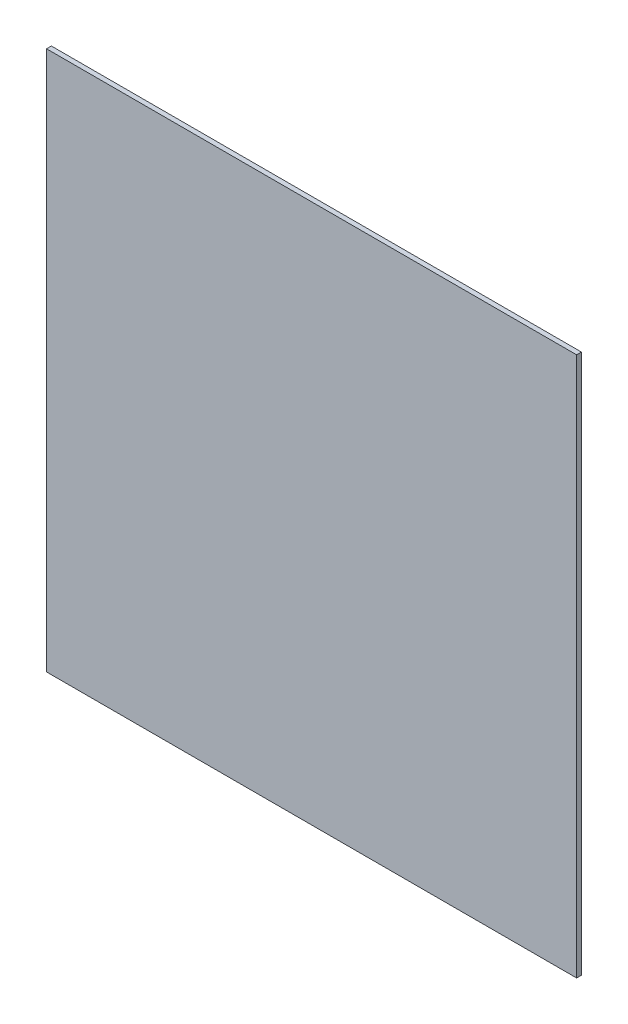
ISO-10303-21;
HEADER;
FILE_DESCRIPTION(('STEP AP214'),'2;1');
FILE_NAME('part.step','',(''),(''),'','','');
FILE_SCHEMA(('AUTOMOTIVE_DESIGN { 1 0 10303 214 1 1 1 1 }'));
ENDSEC;
DATA;
#1=APPLICATION_CONTEXT('core data for automotive mechanical design processes');
#2=APPLICATION_PROTOCOL_DEFINITION('international standard','automotive_design',2000,#1);
#3=PRODUCT_CONTEXT('',#1,'mechanical');
#4=PRODUCT('Part','Part','',(#3));
#5=PRODUCT_RELATED_PRODUCT_CATEGORY('part','',(#4));
#6=PRODUCT_DEFINITION_FORMATION('','',#4);
#7=PRODUCT_DEFINITION_CONTEXT('part definition',#1,'design');
#8=PRODUCT_DEFINITION('design','',#6,#7);
#9=PRODUCT_DEFINITION_SHAPE('','',#8);
#10=(LENGTH_UNIT() NAMED_UNIT(*) SI_UNIT(.MILLI.,.METRE.));
#11=(NAMED_UNIT(*) PLANE_ANGLE_UNIT() SI_UNIT($,.RADIAN.));
#12=(NAMED_UNIT(*) SI_UNIT($,.STERADIAN.) SOLID_ANGLE_UNIT());
#13=UNCERTAINTY_MEASURE_WITH_UNIT(LENGTH_MEASURE(1.E-05),#10,'distance_accuracy_value','');
#14=(GEOMETRIC_REPRESENTATION_CONTEXT(3) GLOBAL_UNCERTAINTY_ASSIGNED_CONTEXT((#13)) GLOBAL_UNIT_ASSIGNED_CONTEXT((#10,
#11,#12)) REPRESENTATION_CONTEXT('',''));
#15=CARTESIAN_POINT('',(0.,0.,0.));
#16=DIRECTION('',(0.,0.,1.));
#17=DIRECTION('',(1.,0.,0.));
#18=AXIS2_PLACEMENT_3D('',#15,#16,#17);
#19=CARTESIAN_POINT('',(0.,0.,0.));
#20=DIRECTION('',(0.,0.,1.));
#21=DIRECTION('',(1.,0.,0.));
#22=AXIS2_PLACEMENT_3D('',#19,#20,#21);
#23=PLANE('',#22);
#24=DIRECTION('',(0.,-1.,0.));
#25=VECTOR('',#24,1.);
#26=CARTESIAN_POINT('',(-2750.,-2800.,0.));
#27=LINE('',#26,#25);
#28=CARTESIAN_POINT('',(-2750.,2800.,0.));
#29=VERTEX_POINT('',#28);
#30=CARTESIAN_POINT('',(-2750.,-2800.,0.));
#31=VERTEX_POINT('',#30);
#32=EDGE_CURVE('E158',#29,#31,#27,.T.);
#33=ORIENTED_EDGE('',*,*,#32,.F.);
#34=DIRECTION('',(-1.,0.,0.));
#35=VECTOR('',#34,1.);
#36=CARTESIAN_POINT('',(2750.,2800.,0.));
#37=LINE('',#36,#35);
#38=CARTESIAN_POINT('',(2750.,2800.,0.));
#39=VERTEX_POINT('',#38);
#40=EDGE_CURVE('E193',#39,#29,#37,.T.);
#41=ORIENTED_EDGE('',*,*,#40,.F.);
#42=DIRECTION('',(0.,1.,0.));
#43=VECTOR('',#42,1.);
#44=CARTESIAN_POINT('',(2750.,-2800.,0.));
#45=LINE('',#44,#43);
#46=CARTESIAN_POINT('',(2750.,-2800.,0.));
#47=VERTEX_POINT('',#46);
#48=EDGE_CURVE('E204',#47,#39,#45,.T.);
#49=ORIENTED_EDGE('',*,*,#48,.F.);
#50=DIRECTION('',(1.,0.,0.));
#51=VECTOR('',#50,1.);
#52=CARTESIAN_POINT('',(2750.,-2800.,0.));
#53=LINE('',#52,#51);
#54=EDGE_CURVE('E202',#31,#47,#53,.T.);
#55=ORIENTED_EDGE('',*,*,#54,.F.);
#56=EDGE_LOOP('',(#33,#41,#49,#55));
#57=FACE_BOUND('',#56,.T.);
#58=DIRECTION('',(1.,0.,0.));
#59=VECTOR('',#58,1.);
#60=CARTESIAN_POINT('',(-2.96059473233375E-13,-1000.,0.));
#61=LINE('',#60,#59);
#62=CARTESIAN_POINT('',(624.999999999999,-1000.,0.));
#63=VERTEX_POINT('',#62);
#64=CARTESIAN_POINT('',(1375.,-1000.,0.));
#65=VERTEX_POINT('',#64);
#66=EDGE_CURVE('E175',#63,#65,#61,.T.);
#67=ORIENTED_EDGE('',*,*,#66,.F.);
#68=DIRECTION('',(0.,1.,0.));
#69=VECTOR('',#68,1.);
#70=CARTESIAN_POINT('',(624.999999999999,0.,0.));
#71=LINE('',#70,#69);
#72=CARTESIAN_POINT('',(624.999999999999,-1750.,0.));
#73=VERTEX_POINT('',#72);
#74=EDGE_CURVE('E56',#73,#63,#71,.T.);
#75=ORIENTED_EDGE('',*,*,#74,.F.);
#76=DIRECTION('',(1.,0.,0.));
#77=VECTOR('',#76,1.);
#78=CARTESIAN_POINT('',(-5.18104078158406E-13,-1750.,0.));
#79=LINE('',#78,#77);
#80=CARTESIAN_POINT('',(1375.,-1750.,0.));
#81=VERTEX_POINT('',#80);
#82=EDGE_CURVE('E166',#73,#81,#79,.T.);
#83=ORIENTED_EDGE('',*,*,#82,.T.);
#84=DIRECTION('',(0.,1.,0.));
#85=VECTOR('',#84,1.);
#86=CARTESIAN_POINT('',(1375.,0.,0.));
#87=LINE('',#86,#85);
#88=EDGE_CURVE('E178',#81,#65,#87,.T.);
#89=ORIENTED_EDGE('',*,*,#88,.T.);
#90=EDGE_LOOP('',(#67,#75,#83,#89));
#91=FACE_BOUND('',#90,.T.);
#92=DIRECTION('',(1.,0.,0.));
#93=VECTOR('',#92,1.);
#94=CARTESIAN_POINT('',(4.44089209850062E-13,999.999999999999,0.));
#95=LINE('',#94,#93);
#96=CARTESIAN_POINT('',(624.999999999999,999.999999999999,0.));
#97=VERTEX_POINT('',#96);
#98=CARTESIAN_POINT('',(1375.,999.999999999999,0.));
#99=VERTEX_POINT('',#98);
#100=EDGE_CURVE('E48',#97,#99,#95,.T.);
#101=ORIENTED_EDGE('',*,*,#100,.T.);
#102=DIRECTION('',(0.,1.,0.));
#103=VECTOR('',#102,1.);
#104=CARTESIAN_POINT('',(1375.,0.,0.));
#105=LINE('',#104,#103);
#106=CARTESIAN_POINT('',(1375.,1750.,0.));
#107=VERTEX_POINT('',#106);
#108=EDGE_CURVE('E138',#99,#107,#105,.T.);
#109=ORIENTED_EDGE('',*,*,#108,.T.);
#110=DIRECTION('',(1.,0.,0.));
#111=VECTOR('',#110,1.);
#112=CARTESIAN_POINT('',(0.,1750.,0.));
#113=LINE('',#112,#111);
#114=CARTESIAN_POINT('',(624.999999999999,1750.,0.));
#115=VERTEX_POINT('',#114);
#116=EDGE_CURVE('E151',#115,#107,#113,.T.);
#117=ORIENTED_EDGE('',*,*,#116,.F.);
#118=DIRECTION('',(0.,1.,0.));
#119=VECTOR('',#118,1.);
#120=CARTESIAN_POINT('',(624.999999999999,0.,0.));
#121=LINE('',#120,#119);
#122=EDGE_CURVE('E148',#97,#115,#121,.T.);
#123=ORIENTED_EDGE('',*,*,#122,.F.);
#124=EDGE_LOOP('',(#101,#109,#117,#123));
#125=FACE_BOUND('',#124,.T.);
#126=ADVANCED_FACE('F33',(#57,#91,#125),#23,.F.);
#127=CARTESIAN_POINT('',(-2750.,-2800.,50.));
#128=DIRECTION('',(1.,0.,0.));
#129=DIRECTION('',(0.,0.,-1.));
#130=AXIS2_PLACEMENT_3D('',#127,#128,#129);
#131=PLANE('',#130);
#132=ORIENTED_EDGE('',*,*,#32,.T.);
#133=DIRECTION('',(0.,0.,-1.));
#134=VECTOR('',#133,1.);
#135=CARTESIAN_POINT('',(-2750.,-2800.,50.));
#136=LINE('',#135,#134);
#137=CARTESIAN_POINT('',(-2750.,-2800.,50.));
#138=VERTEX_POINT('',#137);
#139=EDGE_CURVE('E11',#138,#31,#136,.T.);
#140=ORIENTED_EDGE('',*,*,#139,.F.);
#141=DIRECTION('',(0.,-1.,0.));
#142=VECTOR('',#141,1.);
#143=CARTESIAN_POINT('',(-2750.,-2800.,50.));
#144=LINE('',#143,#142);
#145=CARTESIAN_POINT('',(-2750.,2800.,50.));
#146=VERTEX_POINT('',#145);
#147=EDGE_CURVE('E189',#146,#138,#144,.T.);
#148=ORIENTED_EDGE('',*,*,#147,.F.);
#149=DIRECTION('',(0.,0.,-1.));
#150=VECTOR('',#149,1.);
#151=CARTESIAN_POINT('',(-2750.,2800.,50.));
#152=LINE('',#151,#150);
#153=EDGE_CURVE('E199',#146,#29,#152,.T.);
#154=ORIENTED_EDGE('',*,*,#153,.T.);
#155=EDGE_LOOP('',(#132,#140,#148,#154));
#156=FACE_BOUND('',#155,.T.);
#157=ADVANCED_FACE('F35',(#156),#131,.F.);
#158=CARTESIAN_POINT('',(2750.,-2800.,50.));
#159=DIRECTION('',(0.,1.,0.));
#160=DIRECTION('',(-1.,0.,0.));
#161=AXIS2_PLACEMENT_3D('',#158,#159,#160);
#162=PLANE('',#161);
#163=ORIENTED_EDGE('',*,*,#54,.T.);
#164=DIRECTION('',(0.,0.,-1.));
#165=VECTOR('',#164,1.);
#166=CARTESIAN_POINT('',(2750.,-2800.,50.));
#167=LINE('',#166,#165);
#168=CARTESIAN_POINT('',(2750.,-2800.,50.));
#169=VERTEX_POINT('',#168);
#170=EDGE_CURVE('E41',#169,#47,#167,.T.);
#171=ORIENTED_EDGE('',*,*,#170,.F.);
#172=DIRECTION('',(1.,0.,0.));
#173=VECTOR('',#172,1.);
#174=CARTESIAN_POINT('',(2750.,-2800.,50.));
#175=LINE('',#174,#173);
#176=EDGE_CURVE('E192',#138,#169,#175,.T.);
#177=ORIENTED_EDGE('',*,*,#176,.F.);
#178=ORIENTED_EDGE('',*,*,#139,.T.);
#179=EDGE_LOOP('',(#163,#171,#177,#178));
#180=FACE_BOUND('',#179,.T.);
#181=ADVANCED_FACE('F232',(#180),#162,.F.);
#182=CARTESIAN_POINT('',(2750.,-2800.,50.));
#183=DIRECTION('',(-1.,0.,0.));
#184=DIRECTION('',(0.,-1.,0.));
#185=AXIS2_PLACEMENT_3D('',#182,#183,#184);
#186=PLANE('',#185);
#187=ORIENTED_EDGE('',*,*,#48,.T.);
#188=DIRECTION('',(0.,0.,-1.));
#189=VECTOR('',#188,1.);
#190=CARTESIAN_POINT('',(2750.,2800.,50.));
#191=LINE('',#190,#189);
#192=CARTESIAN_POINT('',(2750.,2800.,50.));
#193=VERTEX_POINT('',#192);
#194=EDGE_CURVE('E209',#193,#39,#191,.T.);
#195=ORIENTED_EDGE('',*,*,#194,.F.);
#196=DIRECTION('',(0.,1.,0.));
#197=VECTOR('',#196,1.);
#198=CARTESIAN_POINT('',(2750.,-2800.,50.));
#199=LINE('',#198,#197);
#200=EDGE_CURVE('E195',#169,#193,#199,.T.);
#201=ORIENTED_EDGE('',*,*,#200,.F.);
#202=ORIENTED_EDGE('',*,*,#170,.T.);
#203=EDGE_LOOP('',(#187,#195,#201,#202));
#204=FACE_BOUND('',#203,.T.);
#205=ADVANCED_FACE('F216',(#204),#186,.F.);
#206=CARTESIAN_POINT('',(2750.,2800.,50.));
#207=DIRECTION('',(0.,-1.,0.));
#208=DIRECTION('',(1.,0.,0.));
#209=AXIS2_PLACEMENT_3D('',#206,#207,#208);
#210=PLANE('',#209);
#211=ORIENTED_EDGE('',*,*,#40,.T.);
#212=ORIENTED_EDGE('',*,*,#153,.F.);
#213=DIRECTION('',(-1.,0.,0.));
#214=VECTOR('',#213,1.);
#215=CARTESIAN_POINT('',(2750.,2800.,50.));
#216=LINE('',#215,#214);
#217=EDGE_CURVE('E197',#193,#146,#216,.T.);
#218=ORIENTED_EDGE('',*,*,#217,.F.);
#219=ORIENTED_EDGE('',*,*,#194,.T.);
#220=EDGE_LOOP('',(#211,#212,#218,#219));
#221=FACE_BOUND('',#220,.T.);
#222=ADVANCED_FACE('F225',(#221),#210,.F.);
#223=CARTESIAN_POINT('',(0.,0.,50.));
#224=DIRECTION('',(0.,0.,1.));
#225=DIRECTION('',(1.,0.,0.));
#226=AXIS2_PLACEMENT_3D('',#223,#224,#225);
#227=PLANE('',#226);
#228=ORIENTED_EDGE('',*,*,#147,.T.);
#229=ORIENTED_EDGE('',*,*,#176,.T.);
#230=ORIENTED_EDGE('',*,*,#200,.T.);
#231=ORIENTED_EDGE('',*,*,#217,.T.);
#232=EDGE_LOOP('',(#228,#229,#230,#231));
#233=FACE_BOUND('',#232,.T.);
#234=ADVANCED_FACE('F231',(#233),#227,.T.);
#235=CARTESIAN_POINT('',(624.999999999999,0.,10.));
#236=DIRECTION('',(-1.,0.,0.));
#237=DIRECTION('',(0.,0.,1.));
#238=AXIS2_PLACEMENT_3D('',#235,#236,#237);
#239=PLANE('',#238);
#240=ORIENTED_EDGE('',*,*,#74,.T.);
#241=DIRECTION('',(0.,0.,-1.));
#242=VECTOR('',#241,1.);
#243=CARTESIAN_POINT('',(624.999999999999,-1000.,10.));
#244=LINE('',#243,#242);
#245=CARTESIAN_POINT('',(624.999999999999,-1000.,10.));
#246=VERTEX_POINT('',#245);
#247=EDGE_CURVE('E173',#246,#63,#244,.T.);
#248=ORIENTED_EDGE('',*,*,#247,.F.);
#249=DIRECTION('',(0.,1.,0.));
#250=VECTOR('',#249,1.);
#251=CARTESIAN_POINT('',(624.999999999999,0.,10.));
#252=LINE('',#251,#250);
#253=CARTESIAN_POINT('',(624.999999999999,-1750.,10.));
#254=VERTEX_POINT('',#253);
#255=EDGE_CURVE('E162',#254,#246,#252,.T.);
#256=ORIENTED_EDGE('',*,*,#255,.F.);
#257=DIRECTION('',(0.,0.,-1.));
#258=VECTOR('',#257,1.);
#259=CARTESIAN_POINT('',(624.999999999999,-1750.,10.));
#260=LINE('',#259,#258);
#261=EDGE_CURVE('E149',#254,#73,#260,.T.);
#262=ORIENTED_EDGE('',*,*,#261,.T.);
#263=EDGE_LOOP('',(#240,#248,#256,#262));
#264=FACE_BOUND('',#263,.T.);
#265=ADVANCED_FACE('F252',(#264),#239,.F.);
#266=CARTESIAN_POINT('',(-5.18104078158406E-13,-1750.,10.));
#267=DIRECTION('',(0.,1.,0.));
#268=DIRECTION('',(-1.,0.,0.));
#269=AXIS2_PLACEMENT_3D('',#266,#267,#268);
#270=PLANE('',#269);
#271=ORIENTED_EDGE('',*,*,#82,.F.);
#272=ORIENTED_EDGE('',*,*,#261,.F.);
#273=DIRECTION('',(1.,0.,0.));
#274=VECTOR('',#273,1.);
#275=CARTESIAN_POINT('',(-5.18104078158406E-13,-1750.,10.));
#276=LINE('',#275,#274);
#277=CARTESIAN_POINT('',(1375.,-1750.,10.));
#278=VERTEX_POINT('',#277);
#279=EDGE_CURVE('E171',#254,#278,#276,.T.);
#280=ORIENTED_EDGE('',*,*,#279,.T.);
#281=DIRECTION('',(0.,0.,-1.));
#282=VECTOR('',#281,1.);
#283=CARTESIAN_POINT('',(1375.,-1750.,10.));
#284=LINE('',#283,#282);
#285=EDGE_CURVE('E184',#278,#81,#284,.T.);
#286=ORIENTED_EDGE('',*,*,#285,.T.);
#287=EDGE_LOOP('',(#271,#272,#280,#286));
#288=FACE_BOUND('',#287,.T.);
#289=ADVANCED_FACE('F256',(#288),#270,.T.);
#290=CARTESIAN_POINT('',(1375.,0.,10.));
#291=DIRECTION('',(-1.,0.,0.));
#292=DIRECTION('',(0.,0.,1.));
#293=AXIS2_PLACEMENT_3D('',#290,#291,#292);
#294=PLANE('',#293);
#295=ORIENTED_EDGE('',*,*,#88,.F.);
#296=ORIENTED_EDGE('',*,*,#285,.F.);
#297=DIRECTION('',(0.,1.,0.));
#298=VECTOR('',#297,1.);
#299=CARTESIAN_POINT('',(1375.,0.,10.));
#300=LINE('',#299,#298);
#301=CARTESIAN_POINT('',(1375.,-1000.,10.));
#302=VERTEX_POINT('',#301);
#303=EDGE_CURVE('E169',#278,#302,#300,.T.);
#304=ORIENTED_EDGE('',*,*,#303,.T.);
#305=DIRECTION('',(0.,0.,-1.));
#306=VECTOR('',#305,1.);
#307=CARTESIAN_POINT('',(1375.,-1000.,10.));
#308=LINE('',#307,#306);
#309=EDGE_CURVE('E186',#302,#65,#308,.T.);
#310=ORIENTED_EDGE('',*,*,#309,.T.);
#311=EDGE_LOOP('',(#295,#296,#304,#310));
#312=FACE_BOUND('',#311,.T.);
#313=ADVANCED_FACE('F259',(#312),#294,.T.);
#314=CARTESIAN_POINT('',(-2.96059473233375E-13,-1000.,10.));
#315=DIRECTION('',(0.,1.,0.));
#316=DIRECTION('',(-1.,0.,0.));
#317=AXIS2_PLACEMENT_3D('',#314,#315,#316);
#318=PLANE('',#317);
#319=ORIENTED_EDGE('',*,*,#66,.T.);
#320=ORIENTED_EDGE('',*,*,#309,.F.);
#321=DIRECTION('',(1.,0.,0.));
#322=VECTOR('',#321,1.);
#323=CARTESIAN_POINT('',(-2.96059473233375E-13,-1000.,10.));
#324=LINE('',#323,#322);
#325=EDGE_CURVE('E165',#246,#302,#324,.T.);
#326=ORIENTED_EDGE('',*,*,#325,.F.);
#327=ORIENTED_EDGE('',*,*,#247,.T.);
#328=EDGE_LOOP('',(#319,#320,#326,#327));
#329=FACE_BOUND('',#328,.T.);
#330=ADVANCED_FACE('F263',(#329),#318,.F.);
#331=CARTESIAN_POINT('',(0.,0.,10.));
#332=DIRECTION('',(0.,0.,-1.));
#333=DIRECTION('',(-1.,0.,0.));
#334=AXIS2_PLACEMENT_3D('',#331,#332,#333);
#335=PLANE('',#334);
#336=ORIENTED_EDGE('',*,*,#255,.T.);
#337=ORIENTED_EDGE('',*,*,#325,.T.);
#338=ORIENTED_EDGE('',*,*,#303,.F.);
#339=ORIENTED_EDGE('',*,*,#279,.F.);
#340=EDGE_LOOP('',(#336,#337,#338,#339));
#341=FACE_BOUND('',#340,.T.);
#342=ADVANCED_FACE('F266',(#341),#335,.T.);
#343=CARTESIAN_POINT('',(4.44089209850062E-13,999.999999999999,10.));
#344=DIRECTION('',(0.,1.,0.));
#345=DIRECTION('',(-1.,0.,0.));
#346=AXIS2_PLACEMENT_3D('',#343,#344,#345);
#347=PLANE('',#346);
#348=ORIENTED_EDGE('',*,*,#100,.F.);
#349=DIRECTION('',(0.,0.,-1.));
#350=VECTOR('',#349,1.);
#351=CARTESIAN_POINT('',(624.999999999999,999.999999999999,10.));
#352=LINE('',#351,#350);
#353=CARTESIAN_POINT('',(624.999999999999,999.999999999999,10.));
#354=VERTEX_POINT('',#353);
#355=EDGE_CURVE('E121',#354,#97,#352,.T.);
#356=ORIENTED_EDGE('',*,*,#355,.F.);
#357=DIRECTION('',(1.,0.,0.));
#358=VECTOR('',#357,1.);
#359=CARTESIAN_POINT('',(4.44089209850062E-13,999.999999999999,10.));
#360=LINE('',#359,#358);
#361=CARTESIAN_POINT('',(1375.,999.999999999999,10.));
#362=VERTEX_POINT('',#361);
#363=EDGE_CURVE('E124',#354,#362,#360,.T.);
#364=ORIENTED_EDGE('',*,*,#363,.T.);
#365=DIRECTION('',(0.,0.,-1.));
#366=VECTOR('',#365,1.);
#367=CARTESIAN_POINT('',(1375.,999.999999999999,10.));
#368=LINE('',#367,#366);
#369=EDGE_CURVE('E156',#362,#99,#368,.T.);
#370=ORIENTED_EDGE('',*,*,#369,.T.);
#371=EDGE_LOOP('',(#348,#356,#364,#370));
#372=FACE_BOUND('',#371,.T.);
#373=ADVANCED_FACE('F123',(#372),#347,.T.);
#374=CARTESIAN_POINT('',(1375.,0.,10.));
#375=DIRECTION('',(-1.,0.,0.));
#376=DIRECTION('',(0.,0.,1.));
#377=AXIS2_PLACEMENT_3D('',#374,#375,#376);
#378=PLANE('',#377);
#379=ORIENTED_EDGE('',*,*,#108,.F.);
#380=ORIENTED_EDGE('',*,*,#369,.F.);
#381=DIRECTION('',(0.,1.,0.));
#382=VECTOR('',#381,1.);
#383=CARTESIAN_POINT('',(1375.,0.,10.));
#384=LINE('',#383,#382);
#385=CARTESIAN_POINT('',(1375.,1750.,10.));
#386=VERTEX_POINT('',#385);
#387=EDGE_CURVE('E131',#362,#386,#384,.T.);
#388=ORIENTED_EDGE('',*,*,#387,.T.);
#389=DIRECTION('',(0.,0.,-1.));
#390=VECTOR('',#389,1.);
#391=CARTESIAN_POINT('',(1375.,1750.,10.));
#392=LINE('',#391,#390);
#393=EDGE_CURVE('E159',#386,#107,#392,.T.);
#394=ORIENTED_EDGE('',*,*,#393,.T.);
#395=EDGE_LOOP('',(#379,#380,#388,#394));
#396=FACE_BOUND('',#395,.T.);
#397=ADVANCED_FACE('F276',(#396),#378,.T.);
#398=CARTESIAN_POINT('',(0.,1750.,10.));
#399=DIRECTION('',(0.,1.,0.));
#400=DIRECTION('',(0.,0.,1.));
#401=AXIS2_PLACEMENT_3D('',#398,#399,#400);
#402=PLANE('',#401);
#403=ORIENTED_EDGE('',*,*,#116,.T.);
#404=ORIENTED_EDGE('',*,*,#393,.F.);
#405=DIRECTION('',(1.,0.,0.));
#406=VECTOR('',#405,1.);
#407=CARTESIAN_POINT('',(0.,1750.,10.));
#408=LINE('',#407,#406);
#409=CARTESIAN_POINT('',(624.999999999999,1750.,10.));
#410=VERTEX_POINT('',#409);
#411=EDGE_CURVE('E142',#410,#386,#408,.T.);
#412=ORIENTED_EDGE('',*,*,#411,.F.);
#413=DIRECTION('',(0.,0.,-1.));
#414=VECTOR('',#413,1.);
#415=CARTESIAN_POINT('',(624.999999999999,1750.,10.));
#416=LINE('',#415,#414);
#417=EDGE_CURVE('E130',#410,#115,#416,.T.);
#418=ORIENTED_EDGE('',*,*,#417,.T.);
#419=EDGE_LOOP('',(#403,#404,#412,#418));
#420=FACE_BOUND('',#419,.T.);
#421=ADVANCED_FACE('F279',(#420),#402,.F.);
#422=CARTESIAN_POINT('',(624.999999999999,0.,10.));
#423=DIRECTION('',(-1.,0.,0.));
#424=DIRECTION('',(0.,0.,1.));
#425=AXIS2_PLACEMENT_3D('',#422,#423,#424);
#426=PLANE('',#425);
#427=ORIENTED_EDGE('',*,*,#122,.T.);
#428=ORIENTED_EDGE('',*,*,#417,.F.);
#429=DIRECTION('',(0.,1.,0.));
#430=VECTOR('',#429,1.);
#431=CARTESIAN_POINT('',(624.999999999999,0.,10.));
#432=LINE('',#431,#430);
#433=EDGE_CURVE('E137',#354,#410,#432,.T.);
#434=ORIENTED_EDGE('',*,*,#433,.F.);
#435=ORIENTED_EDGE('',*,*,#355,.T.);
#436=EDGE_LOOP('',(#427,#428,#434,#435));
#437=FACE_BOUND('',#436,.T.);
#438=ADVANCED_FACE('F140',(#437),#426,.F.);
#439=CARTESIAN_POINT('',(0.,0.,10.));
#440=DIRECTION('',(0.,0.,-1.));
#441=DIRECTION('',(-1.,0.,0.));
#442=AXIS2_PLACEMENT_3D('',#439,#440,#441);
#443=PLANE('',#442);
#444=ORIENTED_EDGE('',*,*,#363,.F.);
#445=ORIENTED_EDGE('',*,*,#433,.T.);
#446=ORIENTED_EDGE('',*,*,#411,.T.);
#447=ORIENTED_EDGE('',*,*,#387,.F.);
#448=EDGE_LOOP('',(#444,#445,#446,#447));
#449=FACE_BOUND('',#448,.T.);
#450=ADVANCED_FACE('F135',(#449),#443,.T.);
#451=CLOSED_SHELL('',(#126,#157,#181,#205,#222,#234,#265,#289,#313,#330,#342,#373,#397,#421,
#438,#450));
#452=MANIFOLD_SOLID_BREP('B2',#451);
#453=ADVANCED_BREP_SHAPE_REPRESENTATION('',(#18,#452),#14);
#454=SHAPE_DEFINITION_REPRESENTATION(#9,#453);
ENDSEC;
END-ISO-10303-21;
